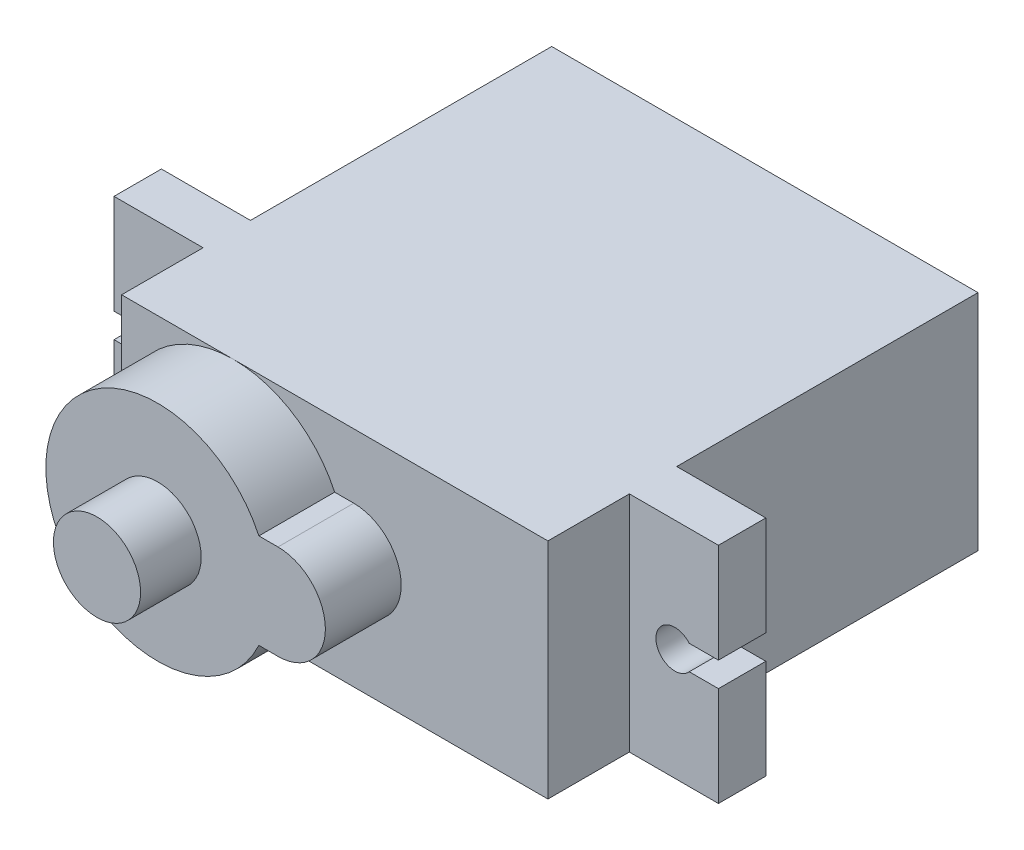
ISO-10303-21;
HEADER;
FILE_DESCRIPTION(('STEP AP214'),'2;1');
FILE_NAME('part.step','',(''),(''),'','','');
FILE_SCHEMA(('AUTOMOTIVE_DESIGN { 1 0 10303 214 1 1 1 1 }'));
ENDSEC;
DATA;
#1=APPLICATION_CONTEXT('core data for automotive mechanical design processes');
#2=APPLICATION_PROTOCOL_DEFINITION('international standard','automotive_design',2000,#1);
#3=PRODUCT_CONTEXT('',#1,'mechanical');
#4=PRODUCT('Part','Part','',(#3));
#5=PRODUCT_RELATED_PRODUCT_CATEGORY('part','',(#4));
#6=PRODUCT_DEFINITION_FORMATION('','',#4);
#7=PRODUCT_DEFINITION_CONTEXT('part definition',#1,'design');
#8=PRODUCT_DEFINITION('design','',#6,#7);
#9=PRODUCT_DEFINITION_SHAPE('','',#8);
#10=(LENGTH_UNIT() NAMED_UNIT(*) SI_UNIT(.MILLI.,.METRE.));
#11=(NAMED_UNIT(*) PLANE_ANGLE_UNIT() SI_UNIT($,.RADIAN.));
#12=(NAMED_UNIT(*) SI_UNIT($,.STERADIAN.) SOLID_ANGLE_UNIT());
#13=UNCERTAINTY_MEASURE_WITH_UNIT(LENGTH_MEASURE(1.E-05),#10,'distance_accuracy_value','');
#14=(GEOMETRIC_REPRESENTATION_CONTEXT(3) GLOBAL_UNCERTAINTY_ASSIGNED_CONTEXT((#13)) GLOBAL_UNIT_ASSIGNED_CONTEXT((#10,
#11,#12)) REPRESENTATION_CONTEXT('',''));
#15=CARTESIAN_POINT('',(0.,0.,0.));
#16=DIRECTION('',(0.,0.,1.));
#17=DIRECTION('',(1.,0.,0.));
#18=AXIS2_PLACEMENT_3D('',#15,#16,#17);
#19=CARTESIAN_POINT('',(0.,0.,22.7));
#20=DIRECTION('',(0.,0.,-1.));
#21=DIRECTION('',(-1.,0.,0.));
#22=AXIS2_PLACEMENT_3D('',#19,#20,#21);
#23=PLANE('',#22);
#24=CARTESIAN_POINT('',(-5.35,0.,22.7));
#25=DIRECTION('',(0.,0.,1.));
#26=DIRECTION('',(1.,0.,0.));
#27=AXIS2_PLACEMENT_3D('',#24,#25,#26);
#28=CIRCLE('',#27,5.9);
#29=CARTESIAN_POINT('',(-11.25,0.,22.7));
#30=VERTEX_POINT('',#29);
#31=CARTESIAN_POINT('',(-5.35,-5.9,22.7));
#32=VERTEX_POINT('',#31);
#33=EDGE_CURVE('E302',#30,#32,#28,.T.);
#34=ORIENTED_EDGE('',*,*,#33,.F.);
#35=DIRECTION('',(0.,-1.,0.));
#36=VECTOR('',#35,1.);
#37=CARTESIAN_POINT('',(-11.25,-5.9,22.7));
#38=LINE('',#37,#36);
#39=CARTESIAN_POINT('',(-11.25,-5.9,22.7));
#40=VERTEX_POINT('',#39);
#41=EDGE_CURVE('E442',#30,#40,#38,.T.);
#42=ORIENTED_EDGE('',*,*,#41,.T.);
#43=DIRECTION('',(1.,0.,0.));
#44=VECTOR('',#43,1.);
#45=CARTESIAN_POINT('',(-11.25,-5.9,22.7));
#46=LINE('',#45,#44);
#47=EDGE_CURVE('E449',#40,#32,#46,.T.);
#48=ORIENTED_EDGE('',*,*,#47,.T.);
#49=EDGE_LOOP('',(#34,#42,#48));
#50=FACE_BOUND('',#49,.T.);
#51=ADVANCED_FACE('F43',(#50),#23,.F.);
#52=CARTESIAN_POINT('',(-0.00692784620274622,-2.50231492009227,22.7));
#53=VERTEX_POINT('',#52);
#54=EDGE_CURVE('E517',#32,#53,#28,.T.);
#55=ORIENTED_EDGE('',*,*,#54,.F.);
#56=CARTESIAN_POINT('',(11.25,-5.9,22.7));
#57=VERTEX_POINT('',#56);
#58=EDGE_CURVE('E443',#32,#57,#46,.T.);
#59=ORIENTED_EDGE('',*,*,#58,.T.);
#60=DIRECTION('',(0.,1.,0.));
#61=VECTOR('',#60,1.);
#62=CARTESIAN_POINT('',(11.25,-5.9,22.7));
#63=LINE('',#62,#61);
#64=CARTESIAN_POINT('',(11.25,5.9,22.7));
#65=VERTEX_POINT('',#64);
#66=EDGE_CURVE('E433',#57,#65,#63,.T.);
#67=ORIENTED_EDGE('',*,*,#66,.T.);
#68=DIRECTION('',(-1.,0.,0.));
#69=VECTOR('',#68,1.);
#70=CARTESIAN_POINT('',(-11.25,5.9,22.7));
#71=LINE('',#70,#69);
#72=CARTESIAN_POINT('',(-5.35,5.9,22.7));
#73=VERTEX_POINT('',#72);
#74=EDGE_CURVE('E437',#65,#73,#71,.T.);
#75=ORIENTED_EDGE('',*,*,#74,.T.);
#76=CARTESIAN_POINT('',(-0.00587826183596724,2.5000725684833,22.7));
#77=VERTEX_POINT('',#76);
#78=EDGE_CURVE('E297',#77,#73,#28,.T.);
#79=ORIENTED_EDGE('',*,*,#78,.F.);
#80=DIRECTION('',(-1.,0.,0.));
#81=VECTOR('',#80,1.);
#82=CARTESIAN_POINT('',(1.00315963790144,2.5000725684833,22.7));
#83=LINE('',#82,#81);
#84=CARTESIAN_POINT('',(1.00315963790144,2.5000725684833,22.7));
#85=VERTEX_POINT('',#84);
#86=EDGE_CURVE('E296',#85,#77,#83,.T.);
#87=ORIENTED_EDGE('',*,*,#86,.F.);
#88=CARTESIAN_POINT('',(1.00315963790144,-0.00112117580448943,22.7));
#89=DIRECTION('',(0.,0.,1.));
#90=DIRECTION('',(1.,0.,0.));
#91=AXIS2_PLACEMENT_3D('',#88,#89,#90);
#92=CIRCLE('',#91,2.50119374428779);
#93=CARTESIAN_POINT('',(1.00315963790144,-2.50231492009228,22.7));
#94=VERTEX_POINT('',#93);
#95=EDGE_CURVE('E281',#94,#85,#92,.T.);
#96=ORIENTED_EDGE('',*,*,#95,.F.);
#97=DIRECTION('',(1.,0.,0.));
#98=VECTOR('',#97,1.);
#99=CARTESIAN_POINT('',(1.00315963790144,-2.50231492009228,22.7));
#100=LINE('',#99,#98);
#101=EDGE_CURVE('E66',#53,#94,#100,.T.);
#102=ORIENTED_EDGE('',*,*,#101,.F.);
#103=EDGE_LOOP('',(#55,#59,#67,#75,#79,#87,#96,#102));
#104=FACE_BOUND('',#103,.T.);
#105=ADVANCED_FACE('F497',(#104),#23,.F.);
#106=EDGE_CURVE('E305',#73,#30,#28,.T.);
#107=ORIENTED_EDGE('',*,*,#106,.F.);
#108=CARTESIAN_POINT('',(-11.25,5.9,22.7));
#109=VERTEX_POINT('',#108);
#110=EDGE_CURVE('E436',#73,#109,#71,.T.);
#111=ORIENTED_EDGE('',*,*,#110,.T.);
#112=EDGE_CURVE('E445',#109,#30,#38,.T.);
#113=ORIENTED_EDGE('',*,*,#112,.T.);
#114=EDGE_LOOP('',(#107,#111,#113));
#115=FACE_BOUND('',#114,.T.);
#116=ADVANCED_FACE('F496',(#115),#23,.F.);
#117=CARTESIAN_POINT('',(-11.25,-5.9,22.7));
#118=DIRECTION('',(1.,0.,0.));
#119=DIRECTION('',(0.,0.,-1.));
#120=AXIS2_PLACEMENT_3D('',#117,#118,#119);
#121=PLANE('',#120);
#122=DIRECTION('',(0.,1.,0.));
#123=VECTOR('',#122,1.);
#124=CARTESIAN_POINT('',(-11.25,5.9,18.4));
#125=LINE('',#124,#123);
#126=CARTESIAN_POINT('',(-11.25,-5.9,18.4));
#127=VERTEX_POINT('',#126);
#128=CARTESIAN_POINT('',(-11.25,5.9,18.4));
#129=VERTEX_POINT('',#128);
#130=EDGE_CURVE('E323',#127,#129,#125,.T.);
#131=ORIENTED_EDGE('',*,*,#130,.F.);
#132=DIRECTION('',(0.,0.,-1.));
#133=VECTOR('',#132,1.);
#134=CARTESIAN_POINT('',(-11.25,-5.9,22.7));
#135=LINE('',#134,#133);
#136=EDGE_CURVE('E463',#40,#127,#135,.T.);
#137=ORIENTED_EDGE('',*,*,#136,.F.);
#138=ORIENTED_EDGE('',*,*,#41,.F.);
#139=ORIENTED_EDGE('',*,*,#112,.F.);
#140=DIRECTION('',(0.,0.,-1.));
#141=VECTOR('',#140,1.);
#142=CARTESIAN_POINT('',(-11.25,5.9,22.7));
#143=LINE('',#142,#141);
#144=EDGE_CURVE('E470',#109,#129,#143,.T.);
#145=ORIENTED_EDGE('',*,*,#144,.T.);
#146=EDGE_LOOP('',(#131,#137,#138,#139,#145));
#147=FACE_BOUND('',#146,.T.);
#148=ADVANCED_FACE('F506',(#147),#121,.F.);
#149=CARTESIAN_POINT('',(11.25,-5.9,22.7));
#150=DIRECTION('',(-1.,0.,0.));
#151=DIRECTION('',(0.,0.,1.));
#152=AXIS2_PLACEMENT_3D('',#149,#150,#151);
#153=PLANE('',#152);
#154=DIRECTION('',(0.,-1.,0.));
#155=VECTOR('',#154,1.);
#156=CARTESIAN_POINT('',(11.25,5.9,18.4));
#157=LINE('',#156,#155);
#158=CARTESIAN_POINT('',(11.25,5.9,18.4));
#159=VERTEX_POINT('',#158);
#160=CARTESIAN_POINT('',(11.25,-5.9,18.4));
#161=VERTEX_POINT('',#160);
#162=EDGE_CURVE('E374',#159,#161,#157,.T.);
#163=ORIENTED_EDGE('',*,*,#162,.F.);
#164=DIRECTION('',(0.,0.,-1.));
#165=VECTOR('',#164,1.);
#166=CARTESIAN_POINT('',(11.25,5.9,22.7));
#167=LINE('',#166,#165);
#168=EDGE_CURVE('E472',#65,#159,#167,.T.);
#169=ORIENTED_EDGE('',*,*,#168,.F.);
#170=ORIENTED_EDGE('',*,*,#66,.F.);
#171=DIRECTION('',(0.,0.,-1.));
#172=VECTOR('',#171,1.);
#173=CARTESIAN_POINT('',(11.25,-5.9,22.7));
#174=LINE('',#173,#172);
#175=EDGE_CURVE('E458',#57,#161,#174,.T.);
#176=ORIENTED_EDGE('',*,*,#175,.T.);
#177=EDGE_LOOP('',(#163,#169,#170,#176));
#178=FACE_BOUND('',#177,.T.);
#179=ADVANCED_FACE('F512',(#178),#153,.F.);
#180=CARTESIAN_POINT('',(11.25,5.9,15.9));
#181=VERTEX_POINT('',#180);
#182=CARTESIAN_POINT('',(11.25,5.9,0.));
#183=VERTEX_POINT('',#182);
#184=EDGE_CURVE('E473',#181,#183,#167,.T.);
#185=ORIENTED_EDGE('',*,*,#184,.F.);
#186=DIRECTION('',(0.,-1.,0.));
#187=VECTOR('',#186,1.);
#188=CARTESIAN_POINT('',(11.25,5.9,15.9));
#189=LINE('',#188,#187);
#190=CARTESIAN_POINT('',(11.25,-5.9,15.9));
#191=VERTEX_POINT('',#190);
#192=EDGE_CURVE('E392',#181,#191,#189,.T.);
#193=ORIENTED_EDGE('',*,*,#192,.T.);
#194=CARTESIAN_POINT('',(11.25,-5.9,0.));
#195=VERTEX_POINT('',#194);
#196=EDGE_CURVE('E448',#191,#195,#174,.T.);
#197=ORIENTED_EDGE('',*,*,#196,.T.);
#198=DIRECTION('',(0.,1.,0.));
#199=VECTOR('',#198,1.);
#200=CARTESIAN_POINT('',(11.25,-5.9,0.));
#201=LINE('',#200,#199);
#202=EDGE_CURVE('E435',#195,#183,#201,.T.);
#203=ORIENTED_EDGE('',*,*,#202,.T.);
#204=EDGE_LOOP('',(#185,#193,#197,#203));
#205=FACE_BOUND('',#204,.T.);
#206=ADVANCED_FACE('F44',(#205),#153,.F.);
#207=CARTESIAN_POINT('',(-11.25,5.9,22.7));
#208=DIRECTION('',(0.,-1.,0.));
#209=DIRECTION('',(0.,0.,-1.));
#210=AXIS2_PLACEMENT_3D('',#207,#208,#209);
#211=PLANE('',#210);
#212=DIRECTION('',(-1.,0.,0.));
#213=VECTOR('',#212,1.);
#214=CARTESIAN_POINT('',(-11.25,5.9,0.));
#215=LINE('',#214,#213);
#216=CARTESIAN_POINT('',(-11.25,5.9,0.));
#217=VERTEX_POINT('',#216);
#218=EDGE_CURVE('E452',#183,#217,#215,.T.);
#219=ORIENTED_EDGE('',*,*,#218,.T.);
#220=CARTESIAN_POINT('',(-11.25,5.9,15.9));
#221=VERTEX_POINT('',#220);
#222=EDGE_CURVE('E469',#221,#217,#143,.T.);
#223=ORIENTED_EDGE('',*,*,#222,.F.);
#224=DIRECTION('',(-1.,0.,0.));
#225=VECTOR('',#224,1.);
#226=CARTESIAN_POINT('',(-11.25,5.9,15.9));
#227=LINE('',#226,#225);
#228=CARTESIAN_POINT('',(-15.95,5.9,15.9));
#229=VERTEX_POINT('',#228);
#230=EDGE_CURVE('E337',#221,#229,#227,.T.);
#231=ORIENTED_EDGE('',*,*,#230,.T.);
#232=DIRECTION('',(0.,0.,-1.));
#233=VECTOR('',#232,1.);
#234=CARTESIAN_POINT('',(-15.95,5.9,18.4));
#235=LINE('',#234,#233);
#236=CARTESIAN_POINT('',(-15.95,5.9,18.4));
#237=VERTEX_POINT('',#236);
#238=EDGE_CURVE('E371',#237,#229,#235,.T.);
#239=ORIENTED_EDGE('',*,*,#238,.F.);
#240=DIRECTION('',(-1.,0.,0.));
#241=VECTOR('',#240,1.);
#242=CARTESIAN_POINT('',(-11.25,5.9,18.4));
#243=LINE('',#242,#241);
#244=EDGE_CURVE('E321',#129,#237,#243,.T.);
#245=ORIENTED_EDGE('',*,*,#244,.F.);
#246=ORIENTED_EDGE('',*,*,#144,.F.);
#247=ORIENTED_EDGE('',*,*,#110,.F.);
#248=ORIENTED_EDGE('',*,*,#74,.F.);
#249=ORIENTED_EDGE('',*,*,#168,.T.);
#250=DIRECTION('',(-1.,0.,0.));
#251=VECTOR('',#250,1.);
#252=CARTESIAN_POINT('',(11.25,5.9,18.4));
#253=LINE('',#252,#251);
#254=CARTESIAN_POINT('',(15.95,5.9,18.4));
#255=VERTEX_POINT('',#254);
#256=EDGE_CURVE('E394',#255,#159,#253,.T.);
#257=ORIENTED_EDGE('',*,*,#256,.F.);
#258=DIRECTION('',(0.,0.,-1.));
#259=VECTOR('',#258,1.);
#260=CARTESIAN_POINT('',(15.95,5.9,18.4));
#261=LINE('',#260,#259);
#262=CARTESIAN_POINT('',(15.95,5.9,15.9));
#263=VERTEX_POINT('',#262);
#264=EDGE_CURVE('E393',#255,#263,#261,.T.);
#265=ORIENTED_EDGE('',*,*,#264,.T.);
#266=DIRECTION('',(-1.,0.,0.));
#267=VECTOR('',#266,1.);
#268=CARTESIAN_POINT('',(11.25,5.9,15.9));
#269=LINE('',#268,#267);
#270=EDGE_CURVE('E408',#263,#181,#269,.T.);
#271=ORIENTED_EDGE('',*,*,#270,.T.);
#272=ORIENTED_EDGE('',*,*,#184,.T.);
#273=EDGE_LOOP('',(#219,#223,#231,#239,#245,#246,#247,#248,#249,#257,#265,#271,#272));
#274=FACE_BOUND('',#273,.T.);
#275=ADVANCED_FACE('F524',(#274),#211,.F.);
#276=DIRECTION('',(0.,0.,-1.));
#277=VECTOR('',#276,1.);
#278=CARTESIAN_POINT('',(-11.25,-2.49999999999999,22.7));
#279=LINE('',#278,#277);
#280=CARTESIAN_POINT('',(-11.25,-2.5,6.34414409126592));
#281=VERTEX_POINT('',#280);
#282=CARTESIAN_POINT('',(-11.25,-2.5,4.5));
#283=VERTEX_POINT('',#282);
#284=EDGE_CURVE('E474',#281,#283,#279,.T.);
#285=ORIENTED_EDGE('',*,*,#284,.T.);
#286=DIRECTION('',(0.,1.,0.));
#287=VECTOR('',#286,1.);
#288=CARTESIAN_POINT('',(-11.25,-5.9,4.5));
#289=LINE('',#288,#287);
#290=CARTESIAN_POINT('',(-11.25,1.1,4.5));
#291=VERTEX_POINT('',#290);
#292=EDGE_CURVE('E11',#283,#291,#289,.T.);
#293=ORIENTED_EDGE('',*,*,#292,.T.);
#294=DIRECTION('',(0.,0.,1.));
#295=VECTOR('',#294,1.);
#296=CARTESIAN_POINT('',(-11.25,1.10000000000001,22.7));
#297=LINE('',#296,#295);
#298=CARTESIAN_POINT('',(-11.25,1.1,6.34414409126592));
#299=VERTEX_POINT('',#298);
#300=EDGE_CURVE('E51',#291,#299,#297,.T.);
#301=ORIENTED_EDGE('',*,*,#300,.T.);
#302=DIRECTION('',(0.,-1.,0.));
#303=VECTOR('',#302,1.);
#304=CARTESIAN_POINT('',(-11.25,-5.9,6.34414409126592));
#305=LINE('',#304,#303);
#306=EDGE_CURVE('E480',#299,#281,#305,.T.);
#307=ORIENTED_EDGE('',*,*,#306,.T.);
#308=EDGE_LOOP('',(#285,#293,#301,#307));
#309=FACE_BOUND('',#308,.T.);
#310=CARTESIAN_POINT('',(-11.25,-5.9,15.9));
#311=VERTEX_POINT('',#310);
#312=CARTESIAN_POINT('',(-11.25,-5.9,0.));
#313=VERTEX_POINT('',#312);
#314=EDGE_CURVE('E461',#311,#313,#135,.T.);
#315=ORIENTED_EDGE('',*,*,#314,.F.);
#316=DIRECTION('',(0.,1.,0.));
#317=VECTOR('',#316,1.);
#318=CARTESIAN_POINT('',(-11.25,5.9,15.9));
#319=LINE('',#318,#317);
#320=EDGE_CURVE('E341',#311,#221,#319,.T.);
#321=ORIENTED_EDGE('',*,*,#320,.T.);
#322=ORIENTED_EDGE('',*,*,#222,.T.);
#323=DIRECTION('',(0.,-1.,0.));
#324=VECTOR('',#323,1.);
#325=CARTESIAN_POINT('',(-11.25,-5.9,0.));
#326=LINE('',#325,#324);
#327=EDGE_CURVE('E455',#217,#313,#326,.T.);
#328=ORIENTED_EDGE('',*,*,#327,.T.);
#329=EDGE_LOOP('',(#315,#321,#322,#328));
#330=FACE_BOUND('',#329,.T.);
#331=ADVANCED_FACE('F481',(#309,#330),#121,.F.);
#332=CARTESIAN_POINT('',(-11.25,-5.9,22.7));
#333=DIRECTION('',(0.,1.,0.));
#334=DIRECTION('',(0.,0.,1.));
#335=AXIS2_PLACEMENT_3D('',#332,#333,#334);
#336=PLANE('',#335);
#337=DIRECTION('',(1.,0.,0.));
#338=VECTOR('',#337,1.);
#339=CARTESIAN_POINT('',(-11.25,-5.9,0.));
#340=LINE('',#339,#338);
#341=EDGE_CURVE('E440',#313,#195,#340,.T.);
#342=ORIENTED_EDGE('',*,*,#341,.T.);
#343=ORIENTED_EDGE('',*,*,#196,.F.);
#344=EDGE_CURVE('E465',#161,#191,#174,.T.);
#345=ORIENTED_EDGE('',*,*,#344,.F.);
#346=ORIENTED_EDGE('',*,*,#175,.F.);
#347=ORIENTED_EDGE('',*,*,#58,.F.);
#348=ORIENTED_EDGE('',*,*,#47,.F.);
#349=ORIENTED_EDGE('',*,*,#136,.T.);
#350=EDGE_CURVE('E467',#127,#311,#135,.T.);
#351=ORIENTED_EDGE('',*,*,#350,.T.);
#352=ORIENTED_EDGE('',*,*,#314,.T.);
#353=EDGE_LOOP('',(#342,#343,#345,#346,#347,#348,#349,#351,#352));
#354=FACE_BOUND('',#353,.T.);
#355=ADVANCED_FACE('F546',(#354),#336,.F.);
#356=CARTESIAN_POINT('',(0.,0.,0.));
#357=DIRECTION('',(0.,0.,-1.));
#358=DIRECTION('',(-1.,0.,0.));
#359=AXIS2_PLACEMENT_3D('',#356,#357,#358);
#360=PLANE('',#359);
#361=ORIENTED_EDGE('',*,*,#202,.F.);
#362=ORIENTED_EDGE('',*,*,#341,.F.);
#363=ORIENTED_EDGE('',*,*,#327,.F.);
#364=ORIENTED_EDGE('',*,*,#218,.F.);
#365=EDGE_LOOP('',(#361,#362,#363,#364));
#366=FACE_BOUND('',#365,.T.);
#367=ADVANCED_FACE('F580',(#366),#360,.T.);
#368=CARTESIAN_POINT('',(11.25,5.9,18.4));
#369=DIRECTION('',(1.,0.,0.));
#370=DIRECTION('',(0.,0.,-1.));
#371=AXIS2_PLACEMENT_3D('',#368,#369,#370);
#372=PLANE('',#371);
#373=CARTESIAN_POINT('',(11.25,-5.90402882605667,18.4));
#374=VERTEX_POINT('',#373);
#375=EDGE_CURVE('E377',#161,#374,#157,.T.);
#376=ORIENTED_EDGE('',*,*,#375,.F.);
#377=ORIENTED_EDGE('',*,*,#344,.T.);
#378=CARTESIAN_POINT('',(11.25,-5.90402882605667,15.9));
#379=VERTEX_POINT('',#378);
#380=EDGE_CURVE('E372',#191,#379,#189,.T.);
#381=ORIENTED_EDGE('',*,*,#380,.T.);
#382=DIRECTION('',(0.,0.,-1.));
#383=VECTOR('',#382,1.);
#384=CARTESIAN_POINT('',(11.25,-5.90402882605667,18.4));
#385=LINE('',#384,#383);
#386=EDGE_CURVE('E427',#374,#379,#385,.T.);
#387=ORIENTED_EDGE('',*,*,#386,.F.);
#388=EDGE_LOOP('',(#376,#377,#381,#387));
#389=FACE_BOUND('',#388,.T.);
#390=ADVANCED_FACE('F588',(#389),#372,.F.);
#391=CARTESIAN_POINT('',(11.25,-5.90402882605667,18.4));
#392=DIRECTION('',(0.,1.,0.));
#393=DIRECTION('',(0.,0.,1.));
#394=AXIS2_PLACEMENT_3D('',#391,#392,#393);
#395=PLANE('',#394);
#396=DIRECTION('',(1.,0.,0.));
#397=VECTOR('',#396,1.);
#398=CARTESIAN_POINT('',(11.25,-5.90402882605667,15.9));
#399=LINE('',#398,#397);
#400=CARTESIAN_POINT('',(15.95,-5.90402882605667,15.9));
#401=VERTEX_POINT('',#400);
#402=EDGE_CURVE('E397',#379,#401,#399,.T.);
#403=ORIENTED_EDGE('',*,*,#402,.T.);
#404=DIRECTION('',(0.,0.,-1.));
#405=VECTOR('',#404,1.);
#406=CARTESIAN_POINT('',(15.95,-5.90402882605667,18.4));
#407=LINE('',#406,#405);
#408=CARTESIAN_POINT('',(15.95,-5.90402882605667,18.4));
#409=VERTEX_POINT('',#408);
#410=EDGE_CURVE('E426',#409,#401,#407,.T.);
#411=ORIENTED_EDGE('',*,*,#410,.F.);
#412=DIRECTION('',(1.,0.,0.));
#413=VECTOR('',#412,1.);
#414=CARTESIAN_POINT('',(11.25,-5.90402882605667,18.4));
#415=LINE('',#414,#413);
#416=EDGE_CURVE('E378',#374,#409,#415,.T.);
#417=ORIENTED_EDGE('',*,*,#416,.F.);
#418=ORIENTED_EDGE('',*,*,#386,.T.);
#419=EDGE_LOOP('',(#403,#411,#417,#418));
#420=FACE_BOUND('',#419,.T.);
#421=ADVANCED_FACE('F598',(#420),#395,.F.);
#422=CARTESIAN_POINT('',(15.95,-0.652014413028324,18.4));
#423=DIRECTION('',(-1.,0.,0.));
#424=DIRECTION('',(0.,-1.,0.));
#425=AXIS2_PLACEMENT_3D('',#422,#423,#424);
#426=PLANE('',#425);
#427=DIRECTION('',(0.,1.,0.));
#428=VECTOR('',#427,1.);
#429=CARTESIAN_POINT('',(15.95,-0.652014413028324,15.9));
#430=LINE('',#429,#428);
#431=CARTESIAN_POINT('',(15.95,-0.652014413028324,15.9));
#432=VERTEX_POINT('',#431);
#433=EDGE_CURVE('E398',#401,#432,#430,.T.);
#434=ORIENTED_EDGE('',*,*,#433,.T.);
#435=DIRECTION('',(0.,0.,-1.));
#436=VECTOR('',#435,1.);
#437=CARTESIAN_POINT('',(15.95,-0.652014413028324,18.4));
#438=LINE('',#437,#436);
#439=CARTESIAN_POINT('',(15.95,-0.652014413028324,18.4));
#440=VERTEX_POINT('',#439);
#441=EDGE_CURVE('E421',#440,#432,#438,.T.);
#442=ORIENTED_EDGE('',*,*,#441,.F.);
#443=DIRECTION('',(0.,1.,0.));
#444=VECTOR('',#443,1.);
#445=CARTESIAN_POINT('',(15.95,-0.652014413028324,18.4));
#446=LINE('',#445,#444);
#447=EDGE_CURVE('E381',#409,#440,#446,.T.);
#448=ORIENTED_EDGE('',*,*,#447,.F.);
#449=ORIENTED_EDGE('',*,*,#410,.T.);
#450=EDGE_LOOP('',(#434,#442,#448,#449));
#451=FACE_BOUND('',#450,.T.);
#452=ADVANCED_FACE('F623',(#451),#426,.F.);
#453=CARTESIAN_POINT('',(15.95,-0.652014413028324,18.4));
#454=DIRECTION('',(0.,-1.,0.));
#455=DIRECTION('',(0.,0.,-1.));
#456=AXIS2_PLACEMENT_3D('',#453,#454,#455);
#457=PLANE('',#456);
#458=DIRECTION('',(-1.,0.,0.));
#459=VECTOR('',#458,1.);
#460=CARTESIAN_POINT('',(15.95,-0.652014413028324,15.9));
#461=LINE('',#460,#459);
#462=CARTESIAN_POINT('',(14.4082065715907,-0.652014413028324,15.9));
#463=VERTEX_POINT('',#462);
#464=EDGE_CURVE('E402',#432,#463,#461,.T.);
#465=ORIENTED_EDGE('',*,*,#464,.T.);
#466=DIRECTION('',(0.,0.,-1.));
#467=VECTOR('',#466,1.);
#468=CARTESIAN_POINT('',(14.4082065715907,-0.652014413028324,18.4));
#469=LINE('',#468,#467);
#470=CARTESIAN_POINT('',(14.4082065715907,-0.652014413028324,18.4));
#471=VERTEX_POINT('',#470);
#472=EDGE_CURVE('E419',#471,#463,#469,.T.);
#473=ORIENTED_EDGE('',*,*,#472,.F.);
#474=DIRECTION('',(-1.,0.,0.));
#475=VECTOR('',#474,1.);
#476=CARTESIAN_POINT('',(15.95,-0.652014413028324,18.4));
#477=LINE('',#476,#475);
#478=EDGE_CURVE('E382',#440,#471,#477,.T.);
#479=ORIENTED_EDGE('',*,*,#478,.F.);
#480=ORIENTED_EDGE('',*,*,#441,.T.);
#481=EDGE_LOOP('',(#465,#473,#479,#480));
#482=FACE_BOUND('',#481,.T.);
#483=ADVANCED_FACE('F625',(#482),#457,.F.);
#484=CARTESIAN_POINT('',(13.65,0.,18.4));
#485=DIRECTION('',(0.,0.,-1.));
#486=DIRECTION('',(-1.,0.,0.));
#487=AXIS2_PLACEMENT_3D('',#484,#485,#486);
#488=CYLINDRICAL_SURFACE('',#487,1.);
#489=CARTESIAN_POINT('',(13.65,0.,15.9));
#490=DIRECTION('',(0.,0.,-1.));
#491=DIRECTION('',(1.,0.,0.));
#492=AXIS2_PLACEMENT_3D('',#489,#490,#491);
#493=CIRCLE('',#492,1.);
#494=CARTESIAN_POINT('',(14.4116525973677,0.647985586971676,15.9));
#495=VERTEX_POINT('',#494);
#496=EDGE_CURVE('E401',#463,#495,#493,.T.);
#497=ORIENTED_EDGE('',*,*,#496,.T.);
#498=DIRECTION('',(0.,0.,-1.));
#499=VECTOR('',#498,1.);
#500=CARTESIAN_POINT('',(14.4116525973677,0.647985586971676,18.4));
#501=LINE('',#500,#499);
#502=CARTESIAN_POINT('',(14.4116525973677,0.647985586971676,18.4));
#503=VERTEX_POINT('',#502);
#504=EDGE_CURVE('E417',#503,#495,#501,.T.);
#505=ORIENTED_EDGE('',*,*,#504,.F.);
#506=CARTESIAN_POINT('',(13.65,0.,18.4));
#507=DIRECTION('',(0.,0.,-1.));
#508=DIRECTION('',(1.,0.,0.));
#509=AXIS2_PLACEMENT_3D('',#506,#507,#508);
#510=CIRCLE('',#509,1.);
#511=EDGE_CURVE('E384',#471,#503,#510,.T.);
#512=ORIENTED_EDGE('',*,*,#511,.F.);
#513=ORIENTED_EDGE('',*,*,#472,.T.);
#514=EDGE_LOOP('',(#497,#505,#512,#513));
#515=FACE_BOUND('',#514,.T.);
#516=ADVANCED_FACE('F618',(#515),#488,.F.);
#517=CARTESIAN_POINT('',(15.95,0.647985586971676,18.4));
#518=DIRECTION('',(0.,1.,0.));
#519=DIRECTION('',(0.,0.,1.));
#520=AXIS2_PLACEMENT_3D('',#517,#518,#519);
#521=PLANE('',#520);
#522=DIRECTION('',(1.,0.,0.));
#523=VECTOR('',#522,1.);
#524=CARTESIAN_POINT('',(15.95,0.647985586971676,15.9));
#525=LINE('',#524,#523);
#526=CARTESIAN_POINT('',(15.95,0.647985586971676,15.9));
#527=VERTEX_POINT('',#526);
#528=EDGE_CURVE('E403',#495,#527,#525,.T.);
#529=ORIENTED_EDGE('',*,*,#528,.T.);
#530=DIRECTION('',(0.,0.,-1.));
#531=VECTOR('',#530,1.);
#532=CARTESIAN_POINT('',(15.95,0.647985586971676,18.4));
#533=LINE('',#532,#531);
#534=CARTESIAN_POINT('',(15.95,0.647985586971676,18.4));
#535=VERTEX_POINT('',#534);
#536=EDGE_CURVE('E415',#535,#527,#533,.T.);
#537=ORIENTED_EDGE('',*,*,#536,.F.);
#538=DIRECTION('',(1.,0.,0.));
#539=VECTOR('',#538,1.);
#540=CARTESIAN_POINT('',(15.95,0.647985586971676,18.4));
#541=LINE('',#540,#539);
#542=EDGE_CURVE('E390',#503,#535,#541,.T.);
#543=ORIENTED_EDGE('',*,*,#542,.F.);
#544=ORIENTED_EDGE('',*,*,#504,.T.);
#545=EDGE_LOOP('',(#529,#537,#543,#544));
#546=FACE_BOUND('',#545,.T.);
#547=ADVANCED_FACE('F612',(#546),#521,.F.);
#548=CARTESIAN_POINT('',(15.95,5.9,18.4));
#549=DIRECTION('',(-1.,0.,0.));
#550=DIRECTION('',(0.,-1.,0.));
#551=AXIS2_PLACEMENT_3D('',#548,#549,#550);
#552=PLANE('',#551);
#553=DIRECTION('',(0.,1.,0.));
#554=VECTOR('',#553,1.);
#555=CARTESIAN_POINT('',(15.95,5.9,15.9));
#556=LINE('',#555,#554);
#557=EDGE_CURVE('E406',#527,#263,#556,.T.);
#558=ORIENTED_EDGE('',*,*,#557,.T.);
#559=ORIENTED_EDGE('',*,*,#264,.F.);
#560=DIRECTION('',(0.,1.,0.));
#561=VECTOR('',#560,1.);
#562=CARTESIAN_POINT('',(15.95,5.9,18.4));
#563=LINE('',#562,#561);
#564=EDGE_CURVE('E386',#535,#255,#563,.T.);
#565=ORIENTED_EDGE('',*,*,#564,.F.);
#566=ORIENTED_EDGE('',*,*,#536,.T.);
#567=EDGE_LOOP('',(#558,#559,#565,#566));
#568=FACE_BOUND('',#567,.T.);
#569=ADVANCED_FACE('F614',(#568),#552,.F.);
#570=CARTESIAN_POINT('',(13.65,0.,18.4));
#571=DIRECTION('',(0.,0.,1.));
#572=DIRECTION('',(1.,0.,0.));
#573=AXIS2_PLACEMENT_3D('',#570,#571,#572);
#574=PLANE('',#573);
#575=ORIENTED_EDGE('',*,*,#162,.T.);
#576=ORIENTED_EDGE('',*,*,#375,.T.);
#577=ORIENTED_EDGE('',*,*,#416,.T.);
#578=ORIENTED_EDGE('',*,*,#447,.T.);
#579=ORIENTED_EDGE('',*,*,#478,.T.);
#580=ORIENTED_EDGE('',*,*,#511,.T.);
#581=ORIENTED_EDGE('',*,*,#542,.T.);
#582=ORIENTED_EDGE('',*,*,#564,.T.);
#583=ORIENTED_EDGE('',*,*,#256,.T.);
#584=EDGE_LOOP('',(#575,#576,#577,#578,#579,#580,#581,#582,#583));
#585=FACE_BOUND('',#584,.T.);
#586=ADVANCED_FACE('F601',(#585),#574,.T.);
#587=CARTESIAN_POINT('',(13.65,0.,15.9));
#588=DIRECTION('',(0.,0.,1.));
#589=DIRECTION('',(1.,0.,0.));
#590=AXIS2_PLACEMENT_3D('',#587,#588,#589);
#591=PLANE('',#590);
#592=ORIENTED_EDGE('',*,*,#192,.F.);
#593=ORIENTED_EDGE('',*,*,#270,.F.);
#594=ORIENTED_EDGE('',*,*,#557,.F.);
#595=ORIENTED_EDGE('',*,*,#528,.F.);
#596=ORIENTED_EDGE('',*,*,#496,.F.);
#597=ORIENTED_EDGE('',*,*,#464,.F.);
#598=ORIENTED_EDGE('',*,*,#433,.F.);
#599=ORIENTED_EDGE('',*,*,#402,.F.);
#600=ORIENTED_EDGE('',*,*,#380,.F.);
#601=EDGE_LOOP('',(#592,#593,#594,#595,#596,#597,#598,#599,#600));
#602=FACE_BOUND('',#601,.T.);
#603=ADVANCED_FACE('F591',(#602),#591,.F.);
#604=CARTESIAN_POINT('',(-11.25,5.9,18.4));
#605=DIRECTION('',(-1.,0.,0.));
#606=DIRECTION('',(0.,0.,1.));
#607=AXIS2_PLACEMENT_3D('',#604,#605,#606);
#608=PLANE('',#607);
#609=ORIENTED_EDGE('',*,*,#350,.F.);
#610=CARTESIAN_POINT('',(-11.25,-5.90402882605667,18.4));
#611=VERTEX_POINT('',#610);
#612=EDGE_CURVE('E318',#611,#127,#125,.T.);
#613=ORIENTED_EDGE('',*,*,#612,.F.);
#614=DIRECTION('',(0.,0.,-1.));
#615=VECTOR('',#614,1.);
#616=CARTESIAN_POINT('',(-11.25,-5.90402882605667,18.4));
#617=LINE('',#616,#615);
#618=CARTESIAN_POINT('',(-11.25,-5.90402882605667,15.9));
#619=VERTEX_POINT('',#618);
#620=EDGE_CURVE('E336',#611,#619,#617,.T.);
#621=ORIENTED_EDGE('',*,*,#620,.T.);
#622=EDGE_CURVE('E320',#619,#311,#319,.T.);
#623=ORIENTED_EDGE('',*,*,#622,.T.);
#624=EDGE_LOOP('',(#609,#613,#621,#623));
#625=FACE_BOUND('',#624,.T.);
#626=ADVANCED_FACE('F559',(#625),#608,.F.);
#627=CARTESIAN_POINT('',(-15.95,5.9,18.4));
#628=DIRECTION('',(1.,0.,0.));
#629=DIRECTION('',(0.,1.,0.));
#630=AXIS2_PLACEMENT_3D('',#627,#628,#629);
#631=PLANE('',#630);
#632=DIRECTION('',(0.,-1.,0.));
#633=VECTOR('',#632,1.);
#634=CARTESIAN_POINT('',(-15.95,5.9,15.9));
#635=LINE('',#634,#633);
#636=CARTESIAN_POINT('',(-15.95,0.647985586971653,15.9));
#637=VERTEX_POINT('',#636);
#638=EDGE_CURVE('E344',#229,#637,#635,.T.);
#639=ORIENTED_EDGE('',*,*,#638,.T.);
#640=DIRECTION('',(0.,0.,-1.));
#641=VECTOR('',#640,1.);
#642=CARTESIAN_POINT('',(-15.95,0.647985586971653,18.4));
#643=LINE('',#642,#641);
#644=CARTESIAN_POINT('',(-15.95,0.647985586971653,18.4));
#645=VERTEX_POINT('',#644);
#646=EDGE_CURVE('E366',#645,#637,#643,.T.);
#647=ORIENTED_EDGE('',*,*,#646,.F.);
#648=DIRECTION('',(0.,-1.,0.));
#649=VECTOR('',#648,1.);
#650=CARTESIAN_POINT('',(-15.95,5.9,18.4));
#651=LINE('',#650,#649);
#652=EDGE_CURVE('E324',#237,#645,#651,.T.);
#653=ORIENTED_EDGE('',*,*,#652,.F.);
#654=ORIENTED_EDGE('',*,*,#238,.T.);
#655=EDGE_LOOP('',(#639,#647,#653,#654));
#656=FACE_BOUND('',#655,.T.);
#657=ADVANCED_FACE('F747',(#656),#631,.F.);
#658=CARTESIAN_POINT('',(-15.95,0.647985586971653,18.4));
#659=DIRECTION('',(0.,1.,0.));
#660=DIRECTION('',(0.,0.,1.));
#661=AXIS2_PLACEMENT_3D('',#658,#659,#660);
#662=PLANE('',#661);
#663=DIRECTION('',(1.,0.,0.));
#664=VECTOR('',#663,1.);
#665=CARTESIAN_POINT('',(-15.95,0.647985586971653,15.9));
#666=LINE('',#665,#664);
#667=CARTESIAN_POINT('',(-14.4116525973677,0.647985586971653,15.9));
#668=VERTEX_POINT('',#667);
#669=EDGE_CURVE('E345',#637,#668,#666,.T.);
#670=ORIENTED_EDGE('',*,*,#669,.T.);
#671=DIRECTION('',(0.,0.,-1.));
#672=VECTOR('',#671,1.);
#673=CARTESIAN_POINT('',(-14.4116525973677,0.647985586971653,18.4));
#674=LINE('',#673,#672);
#675=CARTESIAN_POINT('',(-14.4116525973677,0.647985586971653,18.4));
#676=VERTEX_POINT('',#675);
#677=EDGE_CURVE('E364',#676,#668,#674,.T.);
#678=ORIENTED_EDGE('',*,*,#677,.F.);
#679=DIRECTION('',(1.,0.,0.));
#680=VECTOR('',#679,1.);
#681=CARTESIAN_POINT('',(-15.95,0.647985586971653,18.4));
#682=LINE('',#681,#680);
#683=EDGE_CURVE('E330',#645,#676,#682,.T.);
#684=ORIENTED_EDGE('',*,*,#683,.F.);
#685=ORIENTED_EDGE('',*,*,#646,.T.);
#686=EDGE_LOOP('',(#670,#678,#684,#685));
#687=FACE_BOUND('',#686,.T.);
#688=ADVANCED_FACE('F739',(#687),#662,.F.);
#689=CARTESIAN_POINT('',(-13.65,0.,18.4));
#690=DIRECTION('',(0.,0.,-1.));
#691=DIRECTION('',(-1.,0.,0.));
#692=AXIS2_PLACEMENT_3D('',#689,#690,#691);
#693=CYLINDRICAL_SURFACE('',#692,1.);
#694=CARTESIAN_POINT('',(-13.65,0.,15.9));
#695=DIRECTION('',(0.,0.,-1.));
#696=DIRECTION('',(1.,0.,0.));
#697=AXIS2_PLACEMENT_3D('',#694,#695,#696);
#698=CIRCLE('',#697,1.);
#699=CARTESIAN_POINT('',(-14.4082065715907,-0.652014413028347,15.9));
#700=VERTEX_POINT('',#699);
#701=EDGE_CURVE('E350',#668,#700,#698,.T.);
#702=ORIENTED_EDGE('',*,*,#701,.T.);
#703=DIRECTION('',(0.,0.,-1.));
#704=VECTOR('',#703,1.);
#705=CARTESIAN_POINT('',(-14.4082065715907,-0.652014413028347,18.4));
#706=LINE('',#705,#704);
#707=CARTESIAN_POINT('',(-14.4082065715907,-0.652014413028347,18.4));
#708=VERTEX_POINT('',#707);
#709=EDGE_CURVE('E362',#708,#700,#706,.T.);
#710=ORIENTED_EDGE('',*,*,#709,.F.);
#711=CARTESIAN_POINT('',(-13.65,0.,18.4));
#712=DIRECTION('',(0.,0.,-1.));
#713=DIRECTION('',(1.,0.,0.));
#714=AXIS2_PLACEMENT_3D('',#711,#712,#713);
#715=CIRCLE('',#714,1.);
#716=EDGE_CURVE('E328',#676,#708,#715,.T.);
#717=ORIENTED_EDGE('',*,*,#716,.F.);
#718=ORIENTED_EDGE('',*,*,#677,.T.);
#719=EDGE_LOOP('',(#702,#710,#717,#718));
#720=FACE_BOUND('',#719,.T.);
#721=ADVANCED_FACE('F722',(#720),#693,.F.);
#722=CARTESIAN_POINT('',(-15.95,-0.652014413028347,18.4));
#723=DIRECTION('',(0.,-1.,0.));
#724=DIRECTION('',(0.,0.,-1.));
#725=AXIS2_PLACEMENT_3D('',#722,#723,#724);
#726=PLANE('',#725);
#727=DIRECTION('',(-1.,0.,0.));
#728=VECTOR('',#727,1.);
#729=CARTESIAN_POINT('',(-15.95,-0.652014413028347,15.9));
#730=LINE('',#729,#728);
#731=CARTESIAN_POINT('',(-15.95,-0.652014413028347,15.9));
#732=VERTEX_POINT('',#731);
#733=EDGE_CURVE('E349',#700,#732,#730,.T.);
#734=ORIENTED_EDGE('',*,*,#733,.T.);
#735=DIRECTION('',(0.,0.,-1.));
#736=VECTOR('',#735,1.);
#737=CARTESIAN_POINT('',(-15.95,-0.652014413028347,18.4));
#738=LINE('',#737,#736);
#739=CARTESIAN_POINT('',(-15.95,-0.652014413028347,18.4));
#740=VERTEX_POINT('',#739);
#741=EDGE_CURVE('E360',#740,#732,#738,.T.);
#742=ORIENTED_EDGE('',*,*,#741,.F.);
#743=DIRECTION('',(-1.,0.,0.));
#744=VECTOR('',#743,1.);
#745=CARTESIAN_POINT('',(-15.95,-0.652014413028347,18.4));
#746=LINE('',#745,#744);
#747=EDGE_CURVE('E332',#708,#740,#746,.T.);
#748=ORIENTED_EDGE('',*,*,#747,.F.);
#749=ORIENTED_EDGE('',*,*,#709,.T.);
#750=EDGE_LOOP('',(#734,#742,#748,#749));
#751=FACE_BOUND('',#750,.T.);
#752=ADVANCED_FACE('F713',(#751),#726,.F.);
#753=CARTESIAN_POINT('',(-15.95,-0.652014413028347,18.4));
#754=DIRECTION('',(1.,0.,0.));
#755=DIRECTION('',(0.,1.,0.));
#756=AXIS2_PLACEMENT_3D('',#753,#754,#755);
#757=PLANE('',#756);
#758=DIRECTION('',(0.,-1.,0.));
#759=VECTOR('',#758,1.);
#760=CARTESIAN_POINT('',(-15.95,-0.652014413028347,15.9));
#761=LINE('',#760,#759);
#762=CARTESIAN_POINT('',(-15.95,-5.90402882605667,15.9));
#763=VERTEX_POINT('',#762);
#764=EDGE_CURVE('E354',#732,#763,#761,.T.);
#765=ORIENTED_EDGE('',*,*,#764,.T.);
#766=DIRECTION('',(0.,0.,-1.));
#767=VECTOR('',#766,1.);
#768=CARTESIAN_POINT('',(-15.95,-5.90402882605667,18.4));
#769=LINE('',#768,#767);
#770=CARTESIAN_POINT('',(-15.95,-5.90402882605667,18.4));
#771=VERTEX_POINT('',#770);
#772=EDGE_CURVE('E358',#771,#763,#769,.T.);
#773=ORIENTED_EDGE('',*,*,#772,.F.);
#774=DIRECTION('',(0.,-1.,0.));
#775=VECTOR('',#774,1.);
#776=CARTESIAN_POINT('',(-15.95,-0.652014413028347,18.4));
#777=LINE('',#776,#775);
#778=EDGE_CURVE('E334',#740,#771,#777,.T.);
#779=ORIENTED_EDGE('',*,*,#778,.F.);
#780=ORIENTED_EDGE('',*,*,#741,.T.);
#781=EDGE_LOOP('',(#765,#773,#779,#780));
#782=FACE_BOUND('',#781,.T.);
#783=ADVANCED_FACE('F702',(#782),#757,.F.);
#784=CARTESIAN_POINT('',(-11.25,-5.90402882605667,18.4));
#785=DIRECTION('',(0.,1.,0.));
#786=DIRECTION('',(-1.,0.,0.));
#787=AXIS2_PLACEMENT_3D('',#784,#785,#786);
#788=PLANE('',#787);
#789=DIRECTION('',(1.,0.,0.));
#790=VECTOR('',#789,1.);
#791=CARTESIAN_POINT('',(-11.25,-5.90402882605667,15.9));
#792=LINE('',#791,#790);
#793=EDGE_CURVE('E325',#763,#619,#792,.T.);
#794=ORIENTED_EDGE('',*,*,#793,.T.);
#795=ORIENTED_EDGE('',*,*,#620,.F.);
#796=DIRECTION('',(1.,0.,0.));
#797=VECTOR('',#796,1.);
#798=CARTESIAN_POINT('',(-11.25,-5.90402882605667,18.4));
#799=LINE('',#798,#797);
#800=EDGE_CURVE('E333',#771,#611,#799,.T.);
#801=ORIENTED_EDGE('',*,*,#800,.F.);
#802=ORIENTED_EDGE('',*,*,#772,.T.);
#803=EDGE_LOOP('',(#794,#795,#801,#802));
#804=FACE_BOUND('',#803,.T.);
#805=ADVANCED_FACE('F565',(#804),#788,.F.);
#806=CARTESIAN_POINT('',(-13.65,0.,18.4));
#807=DIRECTION('',(0.,0.,1.));
#808=DIRECTION('',(1.,0.,0.));
#809=AXIS2_PLACEMENT_3D('',#806,#807,#808);
#810=PLANE('',#809);
#811=ORIENTED_EDGE('',*,*,#612,.T.);
#812=ORIENTED_EDGE('',*,*,#130,.T.);
#813=ORIENTED_EDGE('',*,*,#244,.T.);
#814=ORIENTED_EDGE('',*,*,#652,.T.);
#815=ORIENTED_EDGE('',*,*,#683,.T.);
#816=ORIENTED_EDGE('',*,*,#716,.T.);
#817=ORIENTED_EDGE('',*,*,#747,.T.);
#818=ORIENTED_EDGE('',*,*,#778,.T.);
#819=ORIENTED_EDGE('',*,*,#800,.T.);
#820=EDGE_LOOP('',(#811,#812,#813,#814,#815,#816,#817,#818,#819));
#821=FACE_BOUND('',#820,.T.);
#822=ADVANCED_FACE('F558',(#821),#810,.T.);
#823=CARTESIAN_POINT('',(-13.65,0.,15.9));
#824=DIRECTION('',(0.,0.,1.));
#825=DIRECTION('',(1.,0.,0.));
#826=AXIS2_PLACEMENT_3D('',#823,#824,#825);
#827=PLANE('',#826);
#828=ORIENTED_EDGE('',*,*,#622,.F.);
#829=ORIENTED_EDGE('',*,*,#793,.F.);
#830=ORIENTED_EDGE('',*,*,#764,.F.);
#831=ORIENTED_EDGE('',*,*,#733,.F.);
#832=ORIENTED_EDGE('',*,*,#701,.F.);
#833=ORIENTED_EDGE('',*,*,#669,.F.);
#834=ORIENTED_EDGE('',*,*,#638,.F.);
#835=ORIENTED_EDGE('',*,*,#230,.F.);
#836=ORIENTED_EDGE('',*,*,#320,.F.);
#837=EDGE_LOOP('',(#828,#829,#830,#831,#832,#833,#834,#835,#836));
#838=FACE_BOUND('',#837,.T.);
#839=ADVANCED_FACE('F566',(#838),#827,.F.);
#840=CARTESIAN_POINT('',(1.00315963790144,-0.00112117580448943,26.7));
#841=DIRECTION('',(0.,0.,-1.));
#842=DIRECTION('',(-1.,0.,0.));
#843=AXIS2_PLACEMENT_3D('',#840,#841,#842);
#844=CYLINDRICAL_SURFACE('',#843,2.50119374428779);
#845=ORIENTED_EDGE('',*,*,#95,.T.);
#846=DIRECTION('',(0.,0.,-1.));
#847=VECTOR('',#846,1.);
#848=CARTESIAN_POINT('',(1.00315963790144,2.5000725684833,26.7));
#849=LINE('',#848,#847);
#850=CARTESIAN_POINT('',(1.00315963790144,2.5000725684833,26.7));
#851=VERTEX_POINT('',#850);
#852=EDGE_CURVE('E314',#851,#85,#849,.T.);
#853=ORIENTED_EDGE('',*,*,#852,.F.);
#854=CARTESIAN_POINT('',(1.00315963790144,-0.00112117580448943,26.7));
#855=DIRECTION('',(0.,0.,1.));
#856=DIRECTION('',(1.,0.,0.));
#857=AXIS2_PLACEMENT_3D('',#854,#855,#856);
#858=CIRCLE('',#857,2.50119374428779);
#859=CARTESIAN_POINT('',(1.00315963790144,-2.50231492009228,26.7));
#860=VERTEX_POINT('',#859);
#861=EDGE_CURVE('E282',#860,#851,#858,.T.);
#862=ORIENTED_EDGE('',*,*,#861,.F.);
#863=DIRECTION('',(0.,0.,-1.));
#864=VECTOR('',#863,1.);
#865=CARTESIAN_POINT('',(1.00315963790144,-2.50231492009228,26.7));
#866=LINE('',#865,#864);
#867=EDGE_CURVE('E294',#860,#94,#866,.T.);
#868=ORIENTED_EDGE('',*,*,#867,.T.);
#869=EDGE_LOOP('',(#845,#853,#862,#868));
#870=FACE_BOUND('',#869,.T.);
#871=ADVANCED_FACE('F537',(#870),#844,.T.);
#872=CARTESIAN_POINT('',(1.00315963790144,2.5000725684833,26.7));
#873=DIRECTION('',(0.,-1.,0.));
#874=DIRECTION('',(0.,0.,-1.));
#875=AXIS2_PLACEMENT_3D('',#872,#873,#874);
#876=PLANE('',#875);
#877=ORIENTED_EDGE('',*,*,#86,.T.);
#878=DIRECTION('',(0.,0.,-1.));
#879=VECTOR('',#878,1.);
#880=CARTESIAN_POINT('',(-0.00587826183596724,2.5000725684833,26.7));
#881=LINE('',#880,#879);
#882=CARTESIAN_POINT('',(-0.00587826183596724,2.5000725684833,26.7));
#883=VERTEX_POINT('',#882);
#884=EDGE_CURVE('E313',#883,#77,#881,.T.);
#885=ORIENTED_EDGE('',*,*,#884,.F.);
#886=DIRECTION('',(-1.,0.,0.));
#887=VECTOR('',#886,1.);
#888=CARTESIAN_POINT('',(1.00315963790144,2.5000725684833,26.7));
#889=LINE('',#888,#887);
#890=EDGE_CURVE('E289',#851,#883,#889,.T.);
#891=ORIENTED_EDGE('',*,*,#890,.F.);
#892=ORIENTED_EDGE('',*,*,#852,.T.);
#893=EDGE_LOOP('',(#877,#885,#891,#892));
#894=FACE_BOUND('',#893,.T.);
#895=ADVANCED_FACE('F533',(#894),#876,.F.);
#896=CARTESIAN_POINT('',(-5.35,0.,26.7));
#897=DIRECTION('',(0.,0.,-1.));
#898=DIRECTION('',(-1.,0.,0.));
#899=AXIS2_PLACEMENT_3D('',#896,#897,#898);
#900=CYLINDRICAL_SURFACE('',#899,5.9);
#901=ORIENTED_EDGE('',*,*,#78,.T.);
#902=ORIENTED_EDGE('',*,*,#106,.T.);
#903=ORIENTED_EDGE('',*,*,#33,.T.);
#904=ORIENTED_EDGE('',*,*,#54,.T.);
#905=DIRECTION('',(0.,0.,-1.));
#906=VECTOR('',#905,1.);
#907=CARTESIAN_POINT('',(-0.00692784620274622,-2.50231492009227,26.7));
#908=LINE('',#907,#906);
#909=CARTESIAN_POINT('',(-0.00692784620274622,-2.50231492009227,26.7));
#910=VERTEX_POINT('',#909);
#911=EDGE_CURVE('E306',#910,#53,#908,.T.);
#912=ORIENTED_EDGE('',*,*,#911,.F.);
#913=CARTESIAN_POINT('',(-5.35,0.,26.7));
#914=DIRECTION('',(0.,0.,1.));
#915=DIRECTION('',(1.,0.,0.));
#916=AXIS2_PLACEMENT_3D('',#913,#914,#915);
#917=CIRCLE('',#916,5.9);
#918=EDGE_CURVE('E290',#883,#910,#917,.T.);
#919=ORIENTED_EDGE('',*,*,#918,.F.);
#920=ORIENTED_EDGE('',*,*,#884,.T.);
#921=EDGE_LOOP('',(#901,#902,#903,#904,#912,#919,#920));
#922=FACE_BOUND('',#921,.T.);
#923=ADVANCED_FACE('F528',(#922),#900,.T.);
#924=CARTESIAN_POINT('',(1.00315963790144,-2.50231492009228,26.7));
#925=DIRECTION('',(0.,1.,0.));
#926=DIRECTION('',(0.,0.,1.));
#927=AXIS2_PLACEMENT_3D('',#924,#925,#926);
#928=PLANE('',#927);
#929=ORIENTED_EDGE('',*,*,#101,.T.);
#930=ORIENTED_EDGE('',*,*,#867,.F.);
#931=DIRECTION('',(1.,0.,0.));
#932=VECTOR('',#931,1.);
#933=CARTESIAN_POINT('',(1.00315963790144,-2.50231492009228,26.7));
#934=LINE('',#933,#932);
#935=EDGE_CURVE('E295',#910,#860,#934,.T.);
#936=ORIENTED_EDGE('',*,*,#935,.F.);
#937=ORIENTED_EDGE('',*,*,#911,.T.);
#938=EDGE_LOOP('',(#929,#930,#936,#937));
#939=FACE_BOUND('',#938,.T.);
#940=ADVANCED_FACE('F536',(#939),#928,.F.);
#941=CARTESIAN_POINT('',(1.00315963790144,-0.00112117580448943,26.7));
#942=DIRECTION('',(0.,0.,1.));
#943=DIRECTION('',(1.,0.,0.));
#944=AXIS2_PLACEMENT_3D('',#941,#942,#943);
#945=PLANE('',#944);
#946=CARTESIAN_POINT('',(-5.35,0.,26.7));
#947=DIRECTION('',(0.,0.,1.));
#948=DIRECTION('',(1.,0.,0.));
#949=AXIS2_PLACEMENT_3D('',#946,#947,#948);
#950=CIRCLE('',#949,2.3);
#951=CARTESIAN_POINT('',(-3.05,0.,26.7));
#952=VERTEX_POINT('',#951);
#953=EDGE_CURVE('E273',#952,#952,#950,.T.);
#954=ORIENTED_EDGE('',*,*,#953,.F.);
#955=EDGE_LOOP('',(#954));
#956=FACE_BOUND('',#955,.T.);
#957=ORIENTED_EDGE('',*,*,#861,.T.);
#958=ORIENTED_EDGE('',*,*,#890,.T.);
#959=ORIENTED_EDGE('',*,*,#918,.T.);
#960=ORIENTED_EDGE('',*,*,#935,.T.);
#961=EDGE_LOOP('',(#957,#958,#959,#960));
#962=FACE_BOUND('',#961,.T.);
#963=ADVANCED_FACE('F541',(#956,#962),#945,.T.);
#964=CARTESIAN_POINT('',(-5.35,0.,29.9));
#965=DIRECTION('',(0.,0.,-1.));
#966=DIRECTION('',(-1.,0.,0.));
#967=AXIS2_PLACEMENT_3D('',#964,#965,#966);
#968=CYLINDRICAL_SURFACE('',#967,2.3);
#969=CARTESIAN_POINT('',(-5.35,0.,29.9));
#970=DIRECTION('',(0.,0.,1.));
#971=DIRECTION('',(1.,0.,0.));
#972=AXIS2_PLACEMENT_3D('',#969,#970,#971);
#973=CIRCLE('',#972,2.3);
#974=CARTESIAN_POINT('',(-3.05,0.,29.9));
#975=VERTEX_POINT('',#974);
#976=EDGE_CURVE('E276',#975,#975,#973,.T.);
#977=ORIENTED_EDGE('',*,*,#976,.F.);
#978=EDGE_LOOP('',(#977));
#979=FACE_BOUND('',#978,.T.);
#980=ORIENTED_EDGE('',*,*,#953,.T.);
#981=EDGE_LOOP('',(#980));
#982=FACE_BOUND('',#981,.T.);
#983=ADVANCED_FACE('F919',(#979,#982),#968,.T.);
#984=CARTESIAN_POINT('',(-5.35,0.,29.9));
#985=DIRECTION('',(0.,0.,1.));
#986=DIRECTION('',(1.,0.,0.));
#987=AXIS2_PLACEMENT_3D('',#984,#985,#986);
#988=PLANE('',#987);
#989=ORIENTED_EDGE('',*,*,#976,.T.);
#990=EDGE_LOOP('',(#989));
#991=FACE_BOUND('',#990,.T.);
#992=ADVANCED_FACE('F888',(#991),#988,.T.);
#993=CARTESIAN_POINT('',(-9.65,1.1,4.5));
#994=DIRECTION('',(0.,0.,-1.));
#995=DIRECTION('',(0.,1.,0.));
#996=AXIS2_PLACEMENT_3D('',#993,#994,#995);
#997=PLANE('',#996);
#998=DIRECTION('',(-1.,0.,0.));
#999=VECTOR('',#998,1.);
#1000=CARTESIAN_POINT('',(-9.65,-2.5,4.5));
#1001=LINE('',#1000,#999);
#1002=CARTESIAN_POINT('',(-9.65,-2.5,4.5));
#1003=VERTEX_POINT('',#1002);
#1004=EDGE_CURVE('E59',#1003,#283,#1001,.T.);
#1005=ORIENTED_EDGE('',*,*,#1004,.F.);
#1006=DIRECTION('',(0.,-1.,0.));
#1007=VECTOR('',#1006,1.);
#1008=CARTESIAN_POINT('',(-9.65,1.1,4.5));
#1009=LINE('',#1008,#1007);
#1010=CARTESIAN_POINT('',(-9.65,1.1,4.5));
#1011=VERTEX_POINT('',#1010);
#1012=EDGE_CURVE('E253',#1011,#1003,#1009,.T.);
#1013=ORIENTED_EDGE('',*,*,#1012,.F.);
#1014=DIRECTION('',(-1.,0.,0.));
#1015=VECTOR('',#1014,1.);
#1016=CARTESIAN_POINT('',(-9.65,1.1,4.5));
#1017=LINE('',#1016,#1015);
#1018=EDGE_CURVE('E275',#1011,#291,#1017,.T.);
#1019=ORIENTED_EDGE('',*,*,#1018,.T.);
#1020=ORIENTED_EDGE('',*,*,#292,.F.);
#1021=EDGE_LOOP('',(#1005,#1013,#1019,#1020));
#1022=FACE_BOUND('',#1021,.T.);
#1023=ADVANCED_FACE('F247',(#1022),#997,.F.);
#1024=CARTESIAN_POINT('',(-9.65,1.1,4.5));
#1025=DIRECTION('',(0.,1.,0.));
#1026=DIRECTION('',(0.,0.,1.));
#1027=AXIS2_PLACEMENT_3D('',#1024,#1025,#1026);
#1028=PLANE('',#1027);
#1029=ORIENTED_EDGE('',*,*,#1018,.F.);
#1030=DIRECTION('',(0.,0.,-1.));
#1031=VECTOR('',#1030,1.);
#1032=CARTESIAN_POINT('',(-9.65,1.1,4.5));
#1033=LINE('',#1032,#1031);
#1034=CARTESIAN_POINT('',(-9.65,1.1,6.34414409126592));
#1035=VERTEX_POINT('',#1034);
#1036=EDGE_CURVE('E254',#1035,#1011,#1033,.T.);
#1037=ORIENTED_EDGE('',*,*,#1036,.F.);
#1038=DIRECTION('',(-1.,0.,0.));
#1039=VECTOR('',#1038,1.);
#1040=CARTESIAN_POINT('',(-9.65,1.1,6.34414409126592));
#1041=LINE('',#1040,#1039);
#1042=EDGE_CURVE('E274',#1035,#299,#1041,.T.);
#1043=ORIENTED_EDGE('',*,*,#1042,.T.);
#1044=ORIENTED_EDGE('',*,*,#300,.F.);
#1045=EDGE_LOOP('',(#1029,#1037,#1043,#1044));
#1046=FACE_BOUND('',#1045,.T.);
#1047=ADVANCED_FACE('F482',(#1046),#1028,.F.);
#1048=CARTESIAN_POINT('',(-9.65,1.1,6.34414409126592));
#1049=DIRECTION('',(0.,0.,1.));
#1050=DIRECTION('',(0.,-1.,0.));
#1051=AXIS2_PLACEMENT_3D('',#1048,#1049,#1050);
#1052=PLANE('',#1051);
#1053=ORIENTED_EDGE('',*,*,#1042,.F.);
#1054=DIRECTION('',(0.,1.,0.));
#1055=VECTOR('',#1054,1.);
#1056=CARTESIAN_POINT('',(-9.65,1.1,6.34414409126592));
#1057=LINE('',#1056,#1055);
#1058=CARTESIAN_POINT('',(-9.65,-2.5,6.34414409126592));
#1059=VERTEX_POINT('',#1058);
#1060=EDGE_CURVE('E262',#1059,#1035,#1057,.T.);
#1061=ORIENTED_EDGE('',*,*,#1060,.F.);
#1062=DIRECTION('',(-1.,0.,0.));
#1063=VECTOR('',#1062,1.);
#1064=CARTESIAN_POINT('',(-9.65,-2.5,6.34414409126592));
#1065=LINE('',#1064,#1063);
#1066=EDGE_CURVE('E255',#1059,#281,#1065,.T.);
#1067=ORIENTED_EDGE('',*,*,#1066,.T.);
#1068=ORIENTED_EDGE('',*,*,#306,.F.);
#1069=EDGE_LOOP('',(#1053,#1061,#1067,#1068));
#1070=FACE_BOUND('',#1069,.T.);
#1071=ADVANCED_FACE('F486',(#1070),#1052,.F.);
#1072=CARTESIAN_POINT('',(-9.65,-2.5,4.5));
#1073=DIRECTION('',(0.,-1.,0.));
#1074=DIRECTION('',(0.,0.,-1.));
#1075=AXIS2_PLACEMENT_3D('',#1072,#1073,#1074);
#1076=PLANE('',#1075);
#1077=ORIENTED_EDGE('',*,*,#1066,.F.);
#1078=DIRECTION('',(0.,0.,1.));
#1079=VECTOR('',#1078,1.);
#1080=CARTESIAN_POINT('',(-9.65,-2.5,4.5));
#1081=LINE('',#1080,#1079);
#1082=EDGE_CURVE('E256',#1003,#1059,#1081,.T.);
#1083=ORIENTED_EDGE('',*,*,#1082,.F.);
#1084=ORIENTED_EDGE('',*,*,#1004,.T.);
#1085=ORIENTED_EDGE('',*,*,#284,.F.);
#1086=EDGE_LOOP('',(#1077,#1083,#1084,#1085));
#1087=FACE_BOUND('',#1086,.T.);
#1088=ADVANCED_FACE('F259',(#1087),#1076,.F.);
#1089=CARTESIAN_POINT('',(-9.65,0.,0.));
#1090=DIRECTION('',(-1.,0.,0.));
#1091=DIRECTION('',(0.,0.,1.));
#1092=AXIS2_PLACEMENT_3D('',#1089,#1090,#1091);
#1093=PLANE('',#1092);
#1094=ORIENTED_EDGE('',*,*,#1012,.T.);
#1095=ORIENTED_EDGE('',*,*,#1082,.T.);
#1096=ORIENTED_EDGE('',*,*,#1060,.T.);
#1097=ORIENTED_EDGE('',*,*,#1036,.T.);
#1098=EDGE_LOOP('',(#1094,#1095,#1096,#1097));
#1099=FACE_BOUND('',#1098,.T.);
#1100=ADVANCED_FACE('F266',(#1099),#1093,.T.);
#1101=CLOSED_SHELL('',(#51,#105,#116,#148,#179,#206,#275,#331,#355,#367,#390,#421,#452,#483,
#516,#547,#569,#586,#603,#626,#657,#688,#721,#752,#783,#805,#822,#839,#871,#895,#923,#940,#963,
#983,#992,#1023,#1047,#1071,#1088,#1100));
#1102=MANIFOLD_SOLID_BREP('B2',#1101);
#1103=ADVANCED_BREP_SHAPE_REPRESENTATION('',(#18,#1102),#14);
#1104=SHAPE_DEFINITION_REPRESENTATION(#9,#1103);
ENDSEC;
END-ISO-10303-21;
